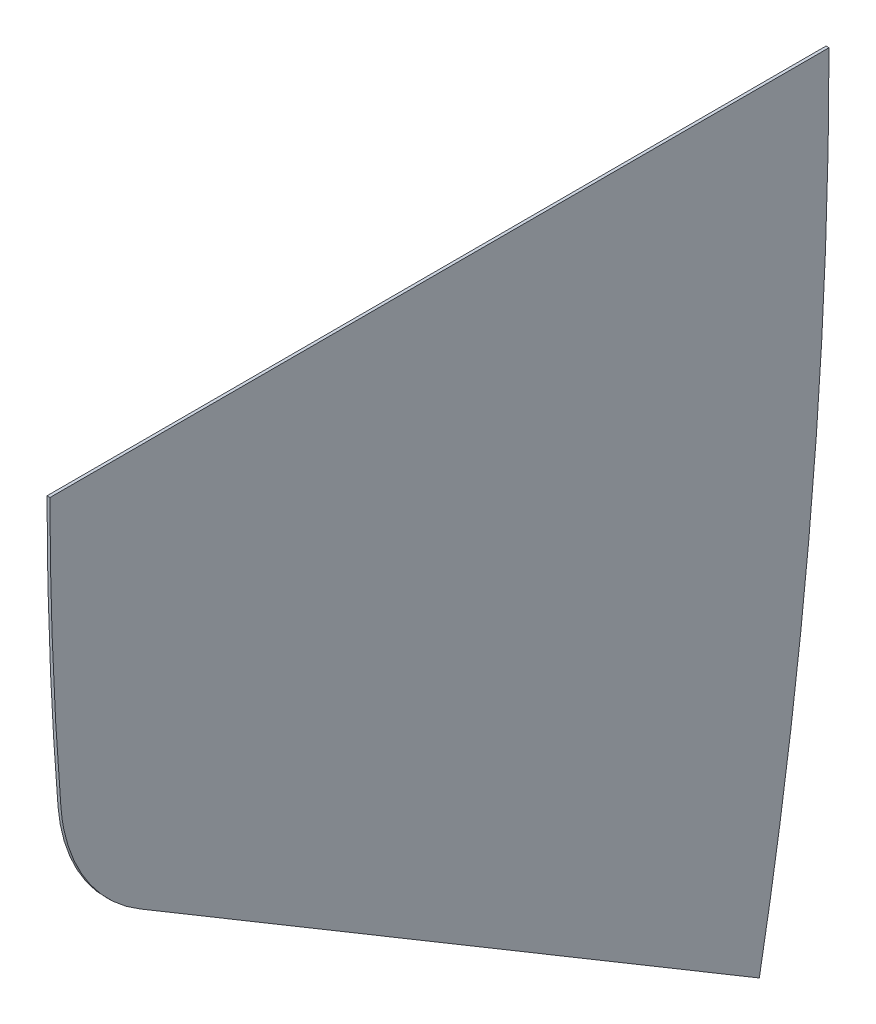
ISO-10303-21;
HEADER;
FILE_DESCRIPTION(('STEP AP214'),'2;1');
FILE_NAME('part.step','',(''),(''),'','','');
FILE_SCHEMA(('AUTOMOTIVE_DESIGN { 1 0 10303 214 1 1 1 1 }'));
ENDSEC;
DATA;
#1=APPLICATION_CONTEXT('core data for automotive mechanical design processes');
#2=APPLICATION_PROTOCOL_DEFINITION('international standard','automotive_design',2000,#1);
#3=PRODUCT_CONTEXT('',#1,'mechanical');
#4=PRODUCT('Part','Part','',(#3));
#5=PRODUCT_RELATED_PRODUCT_CATEGORY('part','',(#4));
#6=PRODUCT_DEFINITION_FORMATION('','',#4);
#7=PRODUCT_DEFINITION_CONTEXT('part definition',#1,'design');
#8=PRODUCT_DEFINITION('design','',#6,#7);
#9=PRODUCT_DEFINITION_SHAPE('','',#8);
#10=(LENGTH_UNIT() NAMED_UNIT(*) SI_UNIT(.MILLI.,.METRE.));
#11=(NAMED_UNIT(*) PLANE_ANGLE_UNIT() SI_UNIT($,.RADIAN.));
#12=(NAMED_UNIT(*) SI_UNIT($,.STERADIAN.) SOLID_ANGLE_UNIT());
#13=UNCERTAINTY_MEASURE_WITH_UNIT(LENGTH_MEASURE(1.E-05),#10,'distance_accuracy_value','');
#14=(GEOMETRIC_REPRESENTATION_CONTEXT(3) GLOBAL_UNCERTAINTY_ASSIGNED_CONTEXT((#13)) GLOBAL_UNIT_ASSIGNED_CONTEXT((#10,
#11,#12)) REPRESENTATION_CONTEXT('',''));
#15=CARTESIAN_POINT('',(0.,0.,0.));
#16=DIRECTION('',(0.,0.,1.));
#17=DIRECTION('',(1.,0.,0.));
#18=AXIS2_PLACEMENT_3D('',#15,#16,#17);
#19=CARTESIAN_POINT('',(-4.15667500419659E-13,1.81898940354586E-12,0.));
#20=DIRECTION('',(0.,1.,0.));
#21=DIRECTION('',(1.,0.,0.));
#22=AXIS2_PLACEMENT_3D('',#19,#20,#21);
#23=PLANE('',#22);
#24=DIRECTION('',(-1.,-3.97903932024659E-13,1.38032640872519E-12));
#25=VECTOR('',#24,1.);
#26=CARTESIAN_POINT('',(-4.00000000001002,-1.59161572810263E-12,5.5213056349146E-12));
#27=LINE('',#26,#25);
#28=CARTESIAN_POINT('',(0.,0.,0.));
#29=VERTEX_POINT('',#28);
#30=CARTESIAN_POINT('',(-8.00000000002005,-3.18323145620525E-12,1.10426112698292E-11));
#31=VERTEX_POINT('',#30);
#32=EDGE_CURVE('E29',#29,#31,#27,.T.);
#33=ORIENTED_EDGE('',*,*,#32,.T.);
#34=CARTESIAN_POINT('',(-8.00000000002005,-3.18323145620525E-12,1.10426112698292E-11));
#35=CARTESIAN_POINT('',(-8.00000000002688,-3.18323145620525E-12,2105.25840120508));
#36=(BOUNDED_CURVE() B_SPLINE_CURVE(1,(#34,#35),.UNSPECIFIED.,.F.,
.F.) B_SPLINE_CURVE_WITH_KNOTS((2,2),(15.0839182796827,2120.34231948474),
.UNSPECIFIED.) CURVE() GEOMETRIC_REPRESENTATION_ITEM() RATIONAL_B_SPLINE_CURVE((1.,1.)) REPRESENTATION_ITEM(''));
#37=CARTESIAN_POINT('',(-8.00000000002906,-2.27373675443232E-12,2105.25840120508));
#38=VERTEX_POINT('',#37);
#39=EDGE_CURVE('E103',#31,#38,#36,.T.);
#40=ORIENTED_EDGE('',*,*,#39,.T.);
#41=CARTESIAN_POINT('',(-8.00000000002688,-3.18323145620525E-12,2105.25840120508));
#42=CARTESIAN_POINT('',(0.,0.,2105.25840120506));
#43=(BOUNDED_CURVE() B_SPLINE_CURVE(1,(#41,#42),.UNSPECIFIED.,.F.,
.F.) B_SPLINE_CURVE_WITH_KNOTS((2,2),(-1.,0.),
.UNSPECIFIED.) CURVE() GEOMETRIC_REPRESENTATION_ITEM() RATIONAL_B_SPLINE_CURVE((1.,1.)) REPRESENTATION_ITEM(''));
#44=CARTESIAN_POINT('',(0.,0.,2105.25840120506));
#45=VERTEX_POINT('',#44);
#46=EDGE_CURVE('E10',#38,#45,#43,.T.);
#47=ORIENTED_EDGE('',*,*,#46,.T.);
#48=CARTESIAN_POINT('',(0.,0.,2105.25840120506));
#49=CARTESIAN_POINT('',(0.,0.,0.));
#50=(BOUNDED_CURVE() B_SPLINE_CURVE(1,(#48,#49),.UNSPECIFIED.,.F.,
.F.) B_SPLINE_CURVE_WITH_KNOTS((2,2),(-2120.34231948474,-15.0839182796827),
.UNSPECIFIED.) CURVE() GEOMETRIC_REPRESENTATION_ITEM() RATIONAL_B_SPLINE_CURVE((1.,1.)) REPRESENTATION_ITEM(''));
#51=EDGE_CURVE('E150',#45,#29,#50,.T.);
#52=ORIENTED_EDGE('',*,*,#51,.T.);
#53=EDGE_LOOP('',(#33,#40,#47,#52));
#54=FACE_BOUND('',#53,.T.);
#55=ADVANCED_FACE('F16',(#54),#23,.T.);
#56=CARTESIAN_POINT('',(0.,1.81898940354586E-12,2105.25840120506));
#57=CARTESIAN_POINT('',(3.26849658449646E-13,-247.452900952764,2105.15515744929));
#58=CARTESIAN_POINT('',(-1.98951966012828E-13,-494.858716043923,2095.21803900071));
#59=CARTESIAN_POINT('',(3.74811293113453E-13,-741.63099538606,2075.4575480513));
#60=CARTESIAN_POINT('',(1.24344978758018E-13,-775.896176998787,2072.7137534174));
#61=CARTESIAN_POINT('',(2.06057393370429E-13,-809.834151180558,2065.95534073106));
#62=CARTESIAN_POINT('',(3.05533376376843E-13,-842.729808078358,2055.24603988153));
#63=CARTESIAN_POINT('',(3.48165940522449E-13,-859.477529499785,2049.79375820789));
#64=CARTESIAN_POINT('',(0.,-875.932419384229,2043.32468240479));
#65=CARTESIAN_POINT('',(5.08038056068472E-13,-891.997989503351,2035.8566204281));
#66=CARTESIAN_POINT('',(0.,-908.074008811072,2028.38370115798));
#67=CARTESIAN_POINT('',(0.,-923.743471132829,2019.91822990809));
#68=CARTESIAN_POINT('',(2.16715534406831E-13,-938.908350284025,2010.4860880126));
#69=CARTESIAN_POINT('',(0.,-953.952906758594,2001.12878354561));
#70=CARTESIAN_POINT('',(2.8421709430404E-13,-968.482638028346,1990.83136278576));
#71=CARTESIAN_POINT('',(0.,-982.401314617929,1979.62858234086));
#72=CARTESIAN_POINT('',(1.84741111297626E-13,-996.097575264539,1968.60481869836));
#73=CARTESIAN_POINT('',(2.77111666946439E-13,-1009.18289712888,1956.71983361948));
#74=CARTESIAN_POINT('',(0.,-1021.5666033896,1944.01731140958));
#75=CARTESIAN_POINT('',(3.48165940522449E-13,-1045.41898726154,1919.55085286211));
#76=CARTESIAN_POINT('',(2.77111666946439E-13,-1066.55422213134,1892.16745836807));
#77=CARTESIAN_POINT('',(-1.63424829224823E-13,-1084.3680953132,1862.30488629375));
#78=CARTESIAN_POINT('',(-3.90798504668055E-13,-1417.22497501416,1304.31441402036));
#79=CARTESIAN_POINT('',(-2.02504679691629E-13,-1750.08185471511,746.323941746978));
#80=CARTESIAN_POINT('',(0.,-2082.93873441606,188.333469473596));
#81=CARTESIAN_POINT('',(-8.00000000002729,-1.36424205265939E-12,2105.25840120508));
#82=CARTESIAN_POINT('',(-8.00000000003119,-247.452900952755,2105.1551574493));
#83=CARTESIAN_POINT('',(-8.00000000003103,-494.858716043934,2095.21803900071));
#84=CARTESIAN_POINT('',(-8.00000000002858,-741.630995386065,2075.45754805132));
#85=CARTESIAN_POINT('',(-8.00000000003404,-775.896176998781,2072.71375341741));
#86=CARTESIAN_POINT('',(-8.00000000002793,-809.83415118057,2065.95534073108));
#87=CARTESIAN_POINT('',(-8.00000000002987,-842.729808078363,2055.24603988155));
#88=CARTESIAN_POINT('',(-8.00000000003063,-859.477529438666,2049.79375822866));
#89=CARTESIAN_POINT('',(-8.00000000003081,-875.932419353489,2043.32468242));
#90=CARTESIAN_POINT('',(-8.00000000003153,-891.997989503363,2035.85662042811));
#91=CARTESIAN_POINT('',(-8.00000000003352,-908.074008860786,2028.38370112981));
#92=CARTESIAN_POINT('',(-8.00000000002764,-923.743471033434,2019.91822996451));
#93=CARTESIAN_POINT('',(-8.00000000003154,-938.908350284038,2010.48608801263));
#94=CARTESIAN_POINT('',(-8.00000000002682,-953.952906758614,2001.12878354565));
#95=CARTESIAN_POINT('',(-8.00000000003134,-968.482638028377,1990.83136278578));
#96=CARTESIAN_POINT('',(-8.00000000003049,-982.401314617953,1979.62858234089));
#97=CARTESIAN_POINT('',(-8.00000000002989,-996.097575315775,1968.60481864994));
#98=CARTESIAN_POINT('',(-8.00000000003179,-1009.1828970265,1956.71983371639));
#99=CARTESIAN_POINT('',(-8.00000000003068,-1021.56660338963,1944.01731140961));
#100=CARTESIAN_POINT('',(-8.00000000002978,-1045.41898726157,1919.55085286212));
#101=CARTESIAN_POINT('',(-8.00000000003376,-1066.55422213136,1892.16745836809));
#102=CARTESIAN_POINT('',(-8.00000000003037,-1084.36809531324,1862.30488629376));
#103=CARTESIAN_POINT('',(-8.00000000002692,-1417.2249750142,1304.31441402039));
#104=CARTESIAN_POINT('',(-8.00000000002973,-1750.08185471513,746.323941746997));
#105=CARTESIAN_POINT('',(-8.00000000002873,-2082.93873441609,188.333469473608));
#106=B_SPLINE_SURFACE_WITH_KNOTS('',1,3,((#56,#57,#58,#59,#60,#61,#62,#63,#64,#65,#66,#67,#68,
#69,#70,#71,#72,#73,#74,#75,#76,#77,#78,#79,#80),(#81,#82,#83,#84,#85,#86,#87,#88,#89,#90,#91,
#92,#93,#94,#95,#96,#97,#98,#99,#100,#101,#102,#103,#104,#105)),.UNSPECIFIED.,.F.,.F.,.F.,(2,2),
(4,2,1,2,1,2,1,2,1,2,1,2,1,2,1,4),(0.,1.),(-3076.99961647915,-2390.84743342106,
-2390.84732984685,-2287.27322299327,-2287.27316998304,-2234.26299359608,-2234.26294019919,
-2180.86610504609,-2180.86605165316,-2127.47318000541,-2127.47312700673,-2074.47449503824,
-2074.47439150558,-1970.94183671468,-1970.9398875293,-21.756461844165),.UNSPECIFIED.);
#107=CARTESIAN_POINT('',(-8.00000000003125,-1.36424205265939E-12,2105.25840120508));
#108=CARTESIAN_POINT('',(-8.00000000002883,-5.33333653627741,2105.25617599548));
#109=CARTESIAN_POINT('',(-8.00000000002785,-10.666669578627,2105.24938266263));
#110=CARTESIAN_POINT('',(-8.00000000002722,-21.3333162006314,2105.22665976535));
#111=CARTESIAN_POINT('',(-8.00000000002756,-26.6666297802862,2105.21073020091));
#112=CARTESIAN_POINT('',(-8.0000000000282,-42.6665343510442,2105.14923713741));
#113=CARTESIAN_POINT('',(-8.00000000002812,-53.3330774357019,2105.08996927306));
#114=CARTESIAN_POINT('',(-8.00000000002825,-69.3326759723189,2104.97365946705));
#115=CARTESIAN_POINT('',(-8.00000000002834,-74.6658365350715,2104.93032156152));
#116=CARTESIAN_POINT('',(-8.00000000002856,-90.6652126589992,2104.78660383821));
#117=CARTESIAN_POINT('',(-8.00000000002867,-101.331310917789,2104.67252007893));
#118=CARTESIAN_POINT('',(-8.00000000002884,-117.330100662793,2104.47398790501));
#119=CARTESIAN_POINT('',(-8.0000000000289,-122.662968036407,2104.40324280433));
#120=CARTESIAN_POINT('',(-8.00000000002907,-138.66139421165,2104.17730421908));
#121=CARTESIAN_POINT('',(-8.00000000002917,-149.326765330117,2104.00840757686));
#122=CARTESIAN_POINT('',(-8.00000000002931,-165.324323611528,2103.7276582727));
#123=CARTESIAN_POINT('',(-8.00000000002936,-170.656757038703,2103.62950784272));
#124=CARTESIAN_POINT('',(-8.00000000002949,-186.653810602962,2103.32135436409));
#125=CARTESIAN_POINT('',(-8.00000000002958,-197.31817228601,2103.09764931259));
#126=CARTESIAN_POINT('',(-8.00000000002969,-213.314077649298,2102.73469025283));
#127=CARTESIAN_POINT('',(-8.00000000002973,-218.645936976619,2102.60913706245));
#128=CARTESIAN_POINT('',(-8.0000000000298,-229.309432729821,2102.3488971534));
#129=CARTESIAN_POINT('',(-8.00000000002983,-234.641069155701,2102.21421043473));
#130=CARTESIAN_POINT('',(-8.00000000002992,-250.635637107928,2101.79645010601));
#131=CARTESIAN_POINT('',(-8.00000000002998,-261.298215573631,2101.49967658955));
#132=CARTESIAN_POINT('',(-8.00000000003005,-277.291256919204,2101.02711990172));
#133=CARTESIAN_POINT('',(-8.00000000003008,-282.622130042598,2100.86503503364));
#134=CARTESIAN_POINT('',(-8.00000000003014,-298.614338716438,2100.36508216373));
#135=CARTESIAN_POINT('',(-8.00000000003017,-309.275251836833,2100.01351622283));
#136=CARTESIAN_POINT('',(-8.00000000003022,-325.265653679147,2099.45877551666));
#137=CARTESIAN_POINT('',(-8.00000000003024,-330.595623387773,2099.2692967606));
#138=CARTESIAN_POINT('',(-8.00000000003028,-346.585051469411,2098.68716451416));
#139=CARTESIAN_POINT('',(-8.0000000000303,-357.2440170663,2098.28081543241));
#140=CARTESIAN_POINT('',(-8.00000000003032,-373.231356953537,2097.64390533669));
#141=CARTESIAN_POINT('',(-8.00000000003032,-378.560282566113,2097.42703768613));
#142=CARTESIAN_POINT('',(-8.00000000003033,-394.546507629614,2096.76274142342));
#143=CARTESIAN_POINT('',(-8.00000000003034,-405.203243576567,2096.30161994743));
#144=CARTESIAN_POINT('',(-8.00000000003033,-421.18710032146,2095.58255720278));
#145=CARTESIAN_POINT('',(-8.00000000003033,-426.514841776036,2095.33830634137));
#146=CARTESIAN_POINT('',(-8.00000000003032,-437.169898454863,2094.84067830783));
#147=CARTESIAN_POINT('',(-8.00000000003031,-442.497213679116,2094.58730113569));
#148=CARTESIAN_POINT('',(-8.00000000003029,-458.47851303761,2093.81348042747));
#149=CARTESIAN_POINT('',(-8.00000000003027,-469.131839131172,2093.27934822714));
#150=CARTESIAN_POINT('',(-8.00000000003023,-485.110392062811,2092.45077867249));
#151=CARTESIAN_POINT('',(-8.00000000003022,-490.436334075147,2092.17002710726));
#152=CARTESIAN_POINT('',(-8.00000000003017,-506.413444487804,2091.31408666974));
#153=CARTESIAN_POINT('',(-8.00000000003013,-517.063885540216,2090.72521264342));
#154=CARTESIAN_POINT('',(-8.00000000003006,-533.037969554124,2089.8145381171));
#155=CARTESIAN_POINT('',(-8.00000000003004,-538.362398368752,2089.50641953759));
#156=CARTESIAN_POINT('',(-8.00000000002997,-554.334898930352,2088.56838190883));
#157=CARTESIAN_POINT('',(-8.00000000002992,-564.982173074652,2087.92478161736));
#158=CARTESIAN_POINT('',(-8.00000000002983,-580.951366083088,2086.93202615706));
#159=CARTESIAN_POINT('',(-8.0000000000298,-586.274141122954,2086.59654869189));
#160=CARTESIAN_POINT('',(-8.00000000002971,-602.241610043315,2085.5764386239));
#161=CARTESIAN_POINT('',(-8.00000000002964,-612.885436007668,2084.87812905686));
#162=CARTESIAN_POINT('',(-8.00000000002953,-628.849316291425,2083.80331886196));
#163=CARTESIAN_POINT('',(-8.0000000000295,-634.170297014964,2083.44049136343));
#164=CARTESIAN_POINT('',(-8.00000000002938,-650.132312422273,2082.33833579709));
#165=CARTESIAN_POINT('',(-8.0000000000293,-660.772408629621,2081.585335427));
#166=CARTESIAN_POINT('',(-8.00000000002917,-676.730555419505,2080.42849880831));
#167=CARTESIAN_POINT('',(-8.00000000002913,-682.04960183646,2080.03833081369));
#168=CARTESIAN_POINT('',(-8.00000000002904,-692.687019263293,2079.24888355142));
#169=CARTESIAN_POINT('',(-8.00000000002899,-698.00539027317,2078.84960428378));
#170=CARTESIAN_POINT('',(-8.00000000002889,-709.709013961665,2077.96086748423));
#171=CARTESIAN_POINT('',(-8.00000000002883,-716.094113874668,2077.46939757688));
#172=CARTESIAN_POINT('',(-8.00000000002871,-728.863316283927,2076.47332295028));
#173=CARTESIAN_POINT('',(-8.00000000002865,-735.247418775849,2075.96871817547));
#174=CARTESIAN_POINT('',(-8.00000000002858,-741.630995385658,2075.45754805136));
#175=B_SPLINE_CURVE_WITH_KNOTS('',3,(#107,#108,#109,#110,#111,#112,#113,#114,#115,#116,#117,
#118,#119,#120,#121,#122,#123,#124,#125,#126,#127,#128,#129,#130,#131,#132,#133,#134,#135,#136,
#137,#138,#139,#140,#141,#142,#143,#144,#145,#146,#147,#148,#149,#150,#151,#152,#153,#154,#155,
#156,#157,#158,#159,#160,#161,#162,#163,#164,#165,#166,#167,#168,#169,#170,#171,#172,#173,#174),
.UNSPECIFIED.,.F.,.F.,(4,2,2,2,2,2,2,2,2,2,2,2,2,2,2,2,2,2,2,2,2,2,2,2,2,2,2,2,2,2,2,2,2,4),(0.,
16.0000058691295,32.000011738259,64.0000586910628,80.0000645601916,112.000111512994,
128.000117382123,160.00016433493,176.00017020406,208.000217156876,224.000223026008,
240.00022889514,272.000275847978,288.000281717113,320.000328669972,336.00033453911,
368.000381491995,384.000387361136,416.00043431405,432.000440183195,448.000446052341,
480.000493005295,496.000498874446,528.000545827429,544.000551696582,576.00059864959,
592.000604518746,624.000651471772,640.00065734093,672.000704293964,688.000710163122,
704.00071603228,723.212661940371,742.42468913436),.UNSPECIFIED.);
#176=CARTESIAN_POINT('',(-8.00000000003318,-741.630995386066,2075.45754805132));
#177=VERTEX_POINT('',#176);
#178=EDGE_CURVE('E90',#38,#177,#175,.T.);
#179=CARTESIAN_POINT('',(-8.00000000003318,-741.630995386066,2075.45754805132));
#180=CARTESIAN_POINT('',(-8.00000000001899,-744.289635418737,2075.24465639558));
#181=CARTESIAN_POINT('',(-8.00000000001712,-746.946278973998,2075.00759796084));
#182=CARTESIAN_POINT('',(-8.00000000002164,-752.255106085203,2074.48519235494));
#183=CARTESIAN_POINT('',(-8.00000000002803,-754.907289124101,2074.19983992944));
#184=CARTESIAN_POINT('',(-8.00000000003504,-762.87038084379,2073.26975749913));
#185=CARTESIAN_POINT('',(-8.00000000002342,-768.172968519328,2072.55219190336));
#186=CARTESIAN_POINT('',(-8.00000000001534,-778.748689165453,2070.92415396594));
#187=CARTESIAN_POINT('',(-8.0000000000189,-784.021820034894,2070.0136680392));
#188=CARTESIAN_POINT('',(-8.00000000001986,-794.535274943497,2068.00026283031));
#189=CARTESIAN_POINT('',(-8.00000000001726,-799.775572175005,2066.89720332768));
#190=CARTESIAN_POINT('',(-8.0000000000215,-810.212911814114,2064.5004733204));
#191=CARTESIAN_POINT('',(-8.00000000002834,-815.40994925343,2063.20678123263));
#192=CARTESIAN_POINT('',(-8.0000000000312,-827.543624069777,2059.95002140985));
#193=CARTESIAN_POINT('',(-8.00000000002266,-834.459823323634,2057.91024616969));
#194=CARTESIAN_POINT('',(-8.0000000000161,-848.185635643477,2053.49276556197));
#195=CARTESIAN_POINT('',(-8.0000000000181,-854.995214918569,2051.11495537544));
#196=CARTESIAN_POINT('',(-8.00000000002066,-868.48980210446,2046.02738839882));
#197=CARTESIAN_POINT('',(-8.00000000002124,-875.174801443818,2043.31760886477));
#198=CARTESIAN_POINT('',(-8.00000000001752,-888.412591569281,2037.56884812182));
#199=CARTESIAN_POINT('',(-8.00000000001322,-894.965188970224,2034.52942160754));
#200=CARTESIAN_POINT('',(-8.00000000002554,-907.912431341659,2028.13198722104));
#201=CARTESIAN_POINT('',(-8.00000000004217,-914.307086293206,2024.77399954532));
#202=CARTESIAN_POINT('',(-7.99999999999659,-926.923684921277,2017.74721407832));
#203=CARTESIAN_POINT('',(-7.99999999993436,-933.145622668334,2014.0784056339));
#204=CARTESIAN_POINT('',(-7.99999999994478,-944.524390838169,2006.98569915214));
#205=CARTESIAN_POINT('',(-7.9999999999994,-949.706247816874,2003.60186023377));
#206=CARTESIAN_POINT('',(-8.00000000003936,-959.923262994748,1996.6181967364));
#207=CARTESIAN_POINT('',(-8.0000000000247,-964.958404527345,1993.01834776011));
#208=CARTESIAN_POINT('',(-8.00000000001406,-974.872859689961,1985.6090545326));
#209=CARTESIAN_POINT('',(-8.00000000001809,-979.752156496414,1981.79958777303));
#210=CARTESIAN_POINT('',(-8.00000000002067,-989.346182500254,1973.97777756267));
#211=CARTESIAN_POINT('',(-8.00000000001922,-994.060894642551,1969.96541319147));
#212=CARTESIAN_POINT('',(-8.00000000001954,-1003.31226198944,1961.74935855731));
#213=CARTESIAN_POINT('',(-8.00000000002129,-1007.8490875886,1957.54586015084));
#214=CARTESIAN_POINT('',(-8.00000000001747,-1016.74128300219,1948.95155739411));
#215=CARTESIAN_POINT('',(-8.00000000001189,-1021.09666219929,1944.56076275285));
#216=CARTESIAN_POINT('',(-8.00000000002687,-1029.61747065411,1935.60049760878));
#217=CARTESIAN_POINT('',(-8.00000000004744,-1033.78294169414,1931.03106682325));
#218=CARTESIAN_POINT('',(-7.99999999999133,-1041.91613243405,1921.72239662815));
#219=CARTESIAN_POINT('',(-7.9999999999147,-1045.88392918713,1916.98322464153));
#220=CARTESIAN_POINT('',(-7.99999999995671,-1051.8637590979,1909.52720239022));
#221=CARTESIAN_POINT('',(-8.00000000000258,-1053.94715998463,1906.86726769759));
#222=CARTESIAN_POINT('',(-8.00000000003617,-1058.05174188693,1901.50060602287));
#223=CARTESIAN_POINT('',(-8.0000000000239,-1060.07293550647,1898.79388869541));
#224=CARTESIAN_POINT('',(-8.00000000001486,-1064.05221889987,1893.33489959086));
#225=CARTESIAN_POINT('',(-8.00000000001809,-1066.01031507998,1890.58263248165));
#226=CARTESIAN_POINT('',(-8.00000000002066,-1069.85895754163,1885.03895276289));
#227=CARTESIAN_POINT('',(-8.00000000002001,-1071.74962425984,1882.24762377363));
#228=CARTESIAN_POINT('',(-8.00000000001875,-1075.46646299771,1876.62195018349));
#229=CARTESIAN_POINT('',(-8.00000000001815,-1077.29262852384,1873.78760129251));
#230=CARTESIAN_POINT('',(-8.00000000002061,-1080.87967416414,1868.07709341005));
#231=CARTESIAN_POINT('',(-8.00000000002367,-1082.64054106726,1865.20092612009));
#232=CARTESIAN_POINT('',(-8.00000000003037,-1084.36809531317,1862.30488629373));
#233=B_SPLINE_CURVE_WITH_KNOTS('',3,(#179,#180,#181,#182,#183,#184,#185,#186,#187,#188,#189,
#190,#191,#192,#193,#194,#195,#196,#197,#198,#199,#200,#201,#202,#203,#204,#205,#206,#207,#208,
#209,#210,#211,#212,#213,#214,#215,#216,#217,#218,#219,#220,#221,#222,#223,#224,#225,#226,#227,
#228,#229,#230,#231,#232),.UNSPECIFIED.,.F.,.F.,(4,2,2,2,2,2,2,2,2,2,2,2,2,2,2,2,2,2,2,2,2,2,2,
2,2,2,4),(0.,8.00121789493779,16.003306878221,32.0521914043726,48.1022064393467,
64.1639572463015,80.2275279381094,101.850574553961,123.480340798494,145.111589776567,
166.772432228417,188.431902319156,210.092115073114,228.653360297039,247.216705884335,
265.7820486732,284.349309619694,302.898327707163,321.446385421754,339.990342426704,
358.527013537144,368.662440447924,378.795800090827,388.928127634983,399.041345188003,
409.155577983643,419.271846020316),.UNSPECIFIED.);
#234=CARTESIAN_POINT('',(-8.00000000003586,-1084.36809531317,1862.30488629372));
#235=VERTEX_POINT('',#234);
#236=EDGE_CURVE('E86',#177,#235,#233,.T.);
#237=DIRECTION('',(0.,0.512301524512095,0.85880565204392));
#238=VECTOR('',#237,1.);
#239=CARTESIAN_POINT('',(-8.00000000001938,-2082.93873441609,188.333469473604));
#240=LINE('',#239,#238);
#241=CARTESIAN_POINT('',(-8.00000000002422,-2082.93873441609,188.333469473604));
#242=VERTEX_POINT('',#241);
#243=EDGE_CURVE('E93',#235,#242,#240,.F.);
#244=CARTESIAN_POINT('',(0.,-2082.93873441606,188.333469473596));
#245=CARTESIAN_POINT('',(-8.00000000002905,-2082.93873441609,188.333469473604));
#246=(BOUNDED_CURVE() B_SPLINE_CURVE(1,(#244,#245),.UNSPECIFIED.,.F.,
.F.) B_SPLINE_CURVE_WITH_KNOTS((2,2),(0.,1.),
.UNSPECIFIED.) CURVE() GEOMETRIC_REPRESENTATION_ITEM() RATIONAL_B_SPLINE_CURVE((1.,1.)) REPRESENTATION_ITEM(''));
#247=CARTESIAN_POINT('',(-9.70423741364355E-12,-2082.93873441606,188.333469473596));
#248=VERTEX_POINT('',#247);
#249=EDGE_CURVE('E146',#248,#242,#246,.T.);
#250=DIRECTION('',(0.,-0.512301524512095,-0.85880565204392));
#251=VECTOR('',#250,1.);
#252=CARTESIAN_POINT('',(-1.94013693999295E-11,-1084.36809531321,1862.30488629375));
#253=LINE('',#252,#251);
#254=CARTESIAN_POINT('',(9.45555102843074E-12,-1084.36809531314,1862.30488629371));
#255=VERTEX_POINT('',#254);
#256=EDGE_CURVE('E22',#248,#255,#253,.F.);
#257=CARTESIAN_POINT('',(9.45555102843074E-12,-1084.36809531314,1862.30488629371));
#258=CARTESIAN_POINT('',(-1.8675376663166E-11,-1083.00194296951,1864.59506594582));
#259=CARTESIAN_POINT('',(-2.30605452548019E-11,-1081.61499691188,1866.8727713385));
#260=CARTESIAN_POINT('',(-1.57405633363564E-11,-1078.79928633017,1871.40359248344));
#261=CARTESIAN_POINT('',(-4.02824351709439E-12,-1077.37050345073,1873.65669682862));
#262=CARTESIAN_POINT('',(8.12075979478621E-12,-1073.01403925301,1880.39030838118));
#263=CARTESIAN_POINT('',(-1.46432972006018E-11,-1070.02461014265,1884.83108475072));
#264=CARTESIAN_POINT('',(-2.41600381286176E-11,-1063.88533983922,1893.60101441637));
#265=CARTESIAN_POINT('',(-1.09082068830547E-11,-1060.73547858195,1897.93015364825));
#266=CARTESIAN_POINT('',(-2.78937530181844E-11,-1054.28014278857,1906.47018624175));
#267=CARTESIAN_POINT('',(-5.81271421627027E-11,-1050.97468255008,1910.68109041116));
#268=CARTESIAN_POINT('',(1.93194514616935E-11,-1044.21263649073,1918.9790322758));
#269=CARTESIAN_POINT('',(1.2698179961179E-10,-1040.75607004849,1923.06608574109));
#270=CARTESIAN_POINT('',(-6.3066179941809E-11,-1035.46685089256,1929.09350263739));
#271=CARTESIAN_POINT('',(-1.84543861813361E-10,-1033.6892361965,1931.08242572242));
#272=CARTESIAN_POINT('',(1.45716701068984E-10,-1030.09835505046,1935.02735465545));
#273=CARTESIAN_POINT('',(5.97370178973226E-10,-1028.28509391168,1936.98336532789));
#274=CARTESIAN_POINT('',(-2.98601184480304E-10,-1025.53889358696,1939.89224546587));
#275=CARTESIAN_POINT('',(-8.59417695787243E-10,-1024.61916585833,1940.85762449646));
#276=CARTESIAN_POINT('',(4.29692208172001E-10,-1023.23302242804,1942.29938634344));
#277=CARTESIAN_POINT('',(1.2144441172087E-09,-1022.76988445301,1942.77892066268));
#278=CARTESIAN_POINT('',(-6.07266867998983E-10,-1022.07354654455,1943.49663809792));
#279=CARTESIAN_POINT('',(-1.71430781182289E-09,-1021.84116231008,1943.7356130049));
#280=CARTESIAN_POINT('',(5.3528827266154E-11,-1021.60123627093,1943.98178308248));
#281=CARTESIAN_POINT('',(1.0985477985295E-10,-1021.59396552448,1943.98924251881));
#282=CARTESIAN_POINT('',(-5.49908451331523E-11,-1021.58305900733,1944.00043128588));
#283=CARTESIAN_POINT('',(-1.51495145719277E-10,-1021.57942343536,1944.00416081033));
#284=CARTESIAN_POINT('',(-6.95098785717083E-11,-1021.57396997803,1944.00975500012));
#285=CARTESIAN_POINT('',(-4.39116985987992E-12,-1021.57215214235,1944.0116197139));
#286=CARTESIAN_POINT('',(2.13172776932409E-12,-1021.56942536403,1944.01441676039));
#287=CARTESIAN_POINT('',(-1.08865005915796E-11,-1021.56851643379,1944.01534910518));
#288=CARTESIAN_POINT('',(4.02384061890889E-12,-1021.56726664897,1944.0166310737));
#289=CARTESIAN_POINT('',(1.14459070554432E-11,-1021.56692579797,1944.0169807009));
#290=CARTESIAN_POINT('',(-1.53606840432001E-11,-1021.5661304777,1944.01779649646));
#291=CARTESIAN_POINT('',(-6.42975895020909E-11,-1021.56567600799,1944.01826266438));
#292=CARTESIAN_POINT('',(-2.26991468031024E-10,-1021.56340365423,1944.02059349893));
#293=CARTESIAN_POINT('',(-9.47764950420219E-11,-1021.56158575458,1944.02245815034));
#294=CARTESIAN_POINT('',(3.78893699820632E-10,-1021.5524961736,1944.03178132676));
#295=CARTESIAN_POINT('',(1.58134910035499E-10,-1021.54522424404,1944.03923960976));
#296=CARTESIAN_POINT('',(-6.32749113927361E-10,-1021.50886327141,1944.07652973348));
#297=CARTESIAN_POINT('',(-2.6414453630872E-10,-1021.4797702547,1944.10635769959));
#298=CARTESIAN_POINT('',(1.05638004607382E-09,-1021.3342839668,1944.25547688005));
#299=CARTESIAN_POINT('',(4.40804147693183E-10,-1021.21782713556,1944.37470609));
#300=CARTESIAN_POINT('',(-1.76337496215383E-09,-1020.63520321007,1944.97052223202));
#301=CARTESIAN_POINT('',(-7.30850669792774E-10,-1020.16802018973,1945.44611597221));
#302=CARTESIAN_POINT('',(2.92352786801497E-09,-1017.82663515344,1947.81884017442));
#303=CARTESIAN_POINT('',(1.01993920457484E-09,-1015.93623980109,1949.70001509931));
#304=CARTESIAN_POINT('',(-2.04109503010237E-09,-1010.21122414057,1955.29440774181));
#305=CARTESIAN_POINT('',(-5.41992931180894E-10,-1006.32552591635,1958.95560142581));
#306=CARTESIAN_POINT('',(5.03231295308172E-10,-998.423240439252,1966.13434912675));
#307=CARTESIAN_POINT('',(4.91998076135201E-11,-994.406642915712,1969.65189182347));
#308=CARTESIAN_POINT('',(-2.44719873886699E-10,-986.248401895406,1976.53820258331));
#309=CARTESIAN_POINT('',(-8.46587554548209E-11,-982.10676874719,1979.90698290219));
#310=CARTESIAN_POINT('',(4.58616476751145E-11,-973.703295764445,1986.4918704095));
#311=CARTESIAN_POINT('',(1.63045705544641E-11,-969.441445588192,1989.70796439878));
#312=CARTESIAN_POINT('',(-1.60925477085324E-11,-960.79318289301,1995.99042824442));
#313=CARTESIAN_POINT('',(-1.88684798919202E-11,-956.406496679034,1999.05642135826));
#314=CARTESIAN_POINT('',(-1.99342973841645E-11,-947.523878295462,2005.02655820764));
#315=CARTESIAN_POINT('',(-1.82238587724688E-11,-943.027938260848,2007.93069024119));
#316=CARTESIAN_POINT('',(-2.05793262146656E-11,-933.931382533198,2013.57407101274));
#317=CARTESIAN_POINT('',(-2.46474213109446E-11,-929.330727821564,2016.31325685548));
#318=CARTESIAN_POINT('',(-1.41554534327584E-11,-920.032629056382,2021.62183794983));
#319=CARTESIAN_POINT('',(4.04126822678182E-13,-915.335187514078,2024.19123759948));
#320=CARTESIAN_POINT('',(-1.60583046390796E-13,-905.849293755019,2029.1571051283));
#321=CARTESIAN_POINT('',(-1.52874260050077E-11,-901.060833746351,2031.55355811685));
#322=CARTESIAN_POINT('',(-2.35153066299197E-11,-891.399532841877,2036.17015758081));
#323=CARTESIAN_POINT('',(-1.66163773028536E-11,-886.526692072529,2038.39030432043));
#324=CARTESIAN_POINT('',(-2.07932657704918E-11,-879.160490224581,2041.58544749317));
#325=CARTESIAN_POINT('',(-2.46040577572588E-11,-876.696136601446,2042.62777235075));
#326=CARTESIAN_POINT('',(-1.41989094866062E-11,-871.748947090922,2044.66724994411));
#327=CARTESIAN_POINT('',(0.,-869.26611201982,2045.66440466133));
#328=CARTESIAN_POINT('',(-5.82317224671728E-11,-861.791329016926,2048.58752368056));
#329=CARTESIAN_POINT('',(-2.31559406353074E-10,-856.772488069559,2050.44540970143));
#330=CARTESIAN_POINT('',(1.15873141911885E-10,-849.204268900316,2053.0911144242));
#331=CARTESIAN_POINT('',(3.3210799257074E-10,-846.678865602243,2053.94825965614));
#332=CARTESIAN_POINT('',(-4.11648523594433E-11,-843.829282571137,2054.88663580655));
#333=CARTESIAN_POINT('',(-9.12004547356317E-11,-843.512555397552,2054.99053624941));
#334=CARTESIAN_POINT('',(2.31833983189797E-11,-843.116499411611,2055.11996173212));
#335=CARTESIAN_POINT('',(5.49065656379145E-11,-843.037280899441,2055.1458243134));
#336=CARTESIAN_POINT('',(-2.69941395525861E-11,-842.918442122651,2055.18458442542));
#337=CARTESIAN_POINT('',(-7.58752822584299E-11,-842.878827362898,2055.19749883592));
#338=CARTESIAN_POINT('',(3.83963519305349E-11,-842.819402473133,2055.21686201091));
#339=CARTESIAN_POINT('',(1.07752454084286E-10,-842.799593718264,2055.22331499575));
#340=CARTESIAN_POINT('',(-5.34177374502254E-11,-842.769879898719,2055.23299236277));
#341=CARTESIAN_POINT('',(-1.51341858537381E-10,-842.759975177673,2055.23621780007));
#342=CARTESIAN_POINT('',(-7.16741028744913E-11,-842.745117924314,2055.24105542841));
#343=CARTESIAN_POINT('',(-7.35919481346593E-12,-842.740165477897,2055.24266788325));
#344=CARTESIAN_POINT('',(2.22173260824205E-12,-842.733974884105,2055.24468334193));
#345=CARTESIAN_POINT('',(5.9728271057383E-13,-842.732736763558,2055.24508642817));
#346=CARTESIAN_POINT('',(1.96133291851225E-13,-842.731034345338,2055.24564066417));
#347=CARTESIAN_POINT('',(2.74140526663875E-13,-842.730570049208,2055.24579181867));
#348=CARTESIAN_POINT('',(3.38235808447438E-13,-842.729622110773,2055.24610042423));
#349=CARTESIAN_POINT('',(3.20358460221386E-13,-842.729138468448,2055.24625787522));
#350=CARTESIAN_POINT('',(2.67568746481651E-13,-842.727416700796,2055.24681839777));
#351=CARTESIAN_POINT('',(2.49588068831436E-13,-842.726178573954,2055.24722146468));
#352=CARTESIAN_POINT('',(5.29241009104352E-13,-842.719987930797,2055.24923677172));
#353=CARTESIAN_POINT('',(1.93554361291377E-12,-842.715035387648,2055.25084892944));
#354=CARTESIAN_POINT('',(-6.21480581704513E-12,-842.690272528758,2055.2589092784));
#355=CARTESIAN_POINT('',(-6.13170453796889E-11,-842.670461783712,2055.26535615078));
#356=CARTESIAN_POINT('',(-2.45875140569613E-10,-842.571405766861,2055.29758347949));
#357=CARTESIAN_POINT('',(-1.02471649556845E-10,-842.492153629185,2055.32334283316));
#358=CARTESIAN_POINT('',(4.1140972545857E-10,-842.095856183865,2055.45202709774));
#359=CARTESIAN_POINT('',(1.72477836248681E-10,-841.778701180816,2055.55461430996));
#360=CARTESIAN_POINT('',(-6.88409469518303E-10,-840.192332643325,2056.06575206697));
#361=CARTESIAN_POINT('',(-3.09007774355093E-10,-838.921375371701,2056.4688957096));
#362=CARTESIAN_POINT('',(3.23495135770134E-10,-835.102744623178,2057.66107759973));
#363=CARTESIAN_POINT('',(7.06746358242692E-11,-832.549626074924,2058.43276252233));
#364=CARTESIAN_POINT('',(-1.09490409404104E-10,-827.429458132006,2059.92967977838));
#365=CARTESIAN_POINT('',(-3.67878501960494E-11,-824.862406774891,2060.65490537359));
#366=CARTESIAN_POINT('',(7.45527494162027E-11,-817.125952970014,2062.76477619779));
#367=CARTESIAN_POINT('',(5.30766333304461E-12,-811.937054030146,2064.07868078789));
#368=CARTESIAN_POINT('',(-4.41135400625224E-11,-801.5142480677,2066.51645801602));
#369=CARTESIAN_POINT('',(-2.4278344922819E-11,-796.280335412995,2067.64030649971));
#370=CARTESIAN_POINT('',(-1.45238380868084E-11,-785.774391658284,2069.69644546166));
#371=CARTESIAN_POINT('',(-2.4607935924146E-11,-780.502356282195,2070.62871409497));
#372=CARTESIAN_POINT('',(-1.41954355909331E-11,-769.928319744895,2072.30019687843));
#373=CARTESIAN_POINT('',(6.29744648449805E-12,-764.626322303057,2073.03943447527));
#374=CARTESIAN_POINT('',(-3.06141410021988E-12,-756.37147811476,2074.03723411869));
#375=CARTESIAN_POINT('',(-1.45217185099435E-11,-753.426610098025,2074.36305253148));
#376=CARTESIAN_POINT('',(-2.42786798672526E-11,-747.532308637776,2074.95500920542));
#377=CARTESIAN_POINT('',(-2.2581647847113E-11,-744.582878061424,2075.22117601595));
#378=CARTESIAN_POINT('',(3.74811190692003E-13,-741.630995385655,2075.45754805134));
#379=B_SPLINE_CURVE_WITH_KNOTS('',3,(#257,#258,#259,#260,#261,#262,#263,#264,#265,#266,#267,
#268,#269,#270,#271,#272,#273,#274,#275,#276,#277,#278,#279,#280,#281,#282,#283,#284,#285,#286,
#287,#288,#289,#290,#291,#292,#293,#294,#295,#296,#297,#298,#299,#300,#301,#302,#303,#304,#305,
#306,#307,#308,#309,#310,#311,#312,#313,#314,#315,#316,#317,#318,#319,#320,#321,#322,#323,#324,
#325,#326,#327,#328,#329,#330,#331,#332,#333,#334,#335,#336,#337,#338,#339,#340,#341,#342,#343,
#344,#345,#346,#347,#348,#349,#350,#351,#352,#353,#354,#355,#356,#357,#358,#359,#360,#361,#362,
#363,#364,#365,#366,#367,#368,#369,#370,#371,#372,#373,#374,#375,#376,#377,#378),.UNSPECIFIED.,
.F.,.F.,(4,2,2,2,2,2,2,2,2,2,2,2,2,2,2,2,2,2,2,2,2,2,2,2,2,2,2,2,2,2,2,2,2,2,2,2,2,2,2,2,2,2,2,
2,2,2,2,2,2,2,2,2,2,2,2,2,2,2,2,2,4),(0.,7.99987253880648,16.0033091210846,32.0591587179301,
48.1170212698739,64.1734111728535,80.2277479300866,88.2299941560879,96.2310569773185,
100.231098325396,102.231103494273,103.231104140417,103.262354140437,103.27797914044,
103.28579164044,103.28969789044,103.291162734209,103.29311585921,103.30092835921,
103.33217835923,103.457178360492,103.957178441232,105.95718360858,113.957514370234,
129.970144189901,145.984033436632,161.99660091081,178.010550099696,194.062824147878,
210.116257218539,226.175773323523,242.234873269386,258.295354251093,274.355811165438,
282.382581407307,290.408999203013,306.459824130388,314.460154719654,315.460155365259,
315.710155375347,315.835155376609,315.897655376767,315.928905376786,315.944530376789,
315.948436626789,315.949901470539,315.951427349442,315.955333599442,315.970958599445,
316.033458599603,316.28345860969,317.283459255184,321.283500569112,329.284575254425,
337.286807764709,353.34091067454,369.397052379073,385.45502387477,401.511043964886,
410.399017888866,419.282728881732),.UNSPECIFIED.);
#380=CARTESIAN_POINT('',(1.0262901486001E-11,-741.630995386061,2075.4575480513));
#381=VERTEX_POINT('',#380);
#382=EDGE_CURVE('E37',#255,#381,#379,.T.);
#383=CARTESIAN_POINT('',(1.0262901486001E-11,-741.630995386061,2075.4575480513));
#384=CARTESIAN_POINT('',(-3.50493550804627E-11,-736.314681896155,2075.88325626813));
#385=CARTESIAN_POINT('',(-6.40479587296382E-11,-730.997997919161,2076.30441130693));
#386=CARTESIAN_POINT('',(-1.49628218518929E-10,-704.41265734064,2078.38742613175));
#387=CARTESIAN_POINT('',(-2.79683767465782E-11,-683.138589687673,2079.98097649949));
#388=CARTESIAN_POINT('',(1.43220046969357E-11,-651.219813819813,2082.26193365953));
#389=CARTESIAN_POINT('',(5.05240966314341E-12,-640.578966227686,2083.00402313466));
#390=CARTESIAN_POINT('',(-9.5540071115932E-12,-608.652562863895,2085.175609344));
#391=CARTESIAN_POINT('',(-1.68826268573111E-12,-587.363240151916,2086.55041684748));
#392=CARTESIAN_POINT('',(1.03378866750002E-12,-555.422706204079,2088.50318660989));
#393=CARTESIAN_POINT('',(4.2838955861991E-13,-544.774793351034,2089.13586834315));
#394=CARTESIAN_POINT('',(-5.29646541544748E-13,-512.827756455382,2090.97919455822));
#395=CARTESIAN_POINT('',(0.,-491.52542779041,2092.1351140035));
#396=CARTESIAN_POINT('',(1.50063023526964E-13,-459.566510051931,2093.75949019924));
#397=CARTESIAN_POINT('',(1.10765695250528E-13,-448.912656803631,2094.28269740474));
#398=CARTESIAN_POINT('',(0.,-416.948361492413,2095.79756905645));
#399=CARTESIAN_POINT('',(0.,-395.635277634465,2096.73447844962));
#400=CARTESIAN_POINT('',(1.02561205823656E-13,-363.661351822396,2098.03028968259));
#401=CARTESIAN_POINT('',(1.02112943825595E-13,-353.002683344878,2098.44396716086));
#402=CARTESIAN_POINT('',(1.04694179436301E-13,-321.024508045613,2099.63022439498));
#403=CARTESIAN_POINT('',(1.11649737160328E-13,-299.702925175708,2100.34802482596));
#404=CARTESIAN_POINT('',(1.18382323343664E-13,-267.717360662025,2101.31513453357));
#405=CARTESIAN_POINT('',(1.20009727495038E-13,-257.05499759357,2101.61923873091));
#406=CARTESIAN_POINT('',(1.22776245232464E-13,-235.72929192708,2102.19091525536));
#407=CARTESIAN_POINT('',(1.23915358818516E-13,-225.065949329045,2102.45848758246));
#408=CARTESIAN_POINT('',(1.25745569077406E-13,-193.074509598195,2103.20640446073));
#409=CARTESIAN_POINT('',(1.248495112496E-13,-171.745094394909,2103.6319460707));
#410=CARTESIAN_POINT('',(1.18641253171924E-13,-139.749287690772,2104.16063444145));
#411=CARTESIAN_POINT('',(1.15761150281873E-13,-129.08376161571,2104.3185929973));
#412=CARTESIAN_POINT('',(1.04776715565599E-13,-98.6831829301879,2104.71674350199));
#413=CARTESIAN_POINT('',(0.,-78.94752854437,2104.91265423853));
#414=CARTESIAN_POINT('',(0.,-39.4745812213413,2105.17936878237));
#415=CARTESIAN_POINT('',(0.,-19.7372882501548,2105.25016756138));
#416=CARTESIAN_POINT('',(0.,1.81898940354586E-12,2105.25840120506));
#417=B_SPLINE_CURVE_WITH_KNOTS('',3,(#383,#384,#385,#386,#387,#388,#389,#390,#391,#392,#393,
#394,#395,#396,#397,#398,#399,#400,#401,#402,#403,#404,#405,#406,#407,#408,#409,#410,#411,#412,
#413,#414,#415,#416),.UNSPECIFIED.,.F.,.F.,(4,2,2,2,2,2,2,2,2,2,2,2,2,2,2,2,4),(0.,
16.0000058651861,80.0003814943702,112.000428447405,176.000804076593,208.000851029602,
272.001226658456,304.001273611411,368.001649239803,400.001696192698,464.002071820634,
496.002118773479,528.00216572631,592.002541353821,624.002588306627,683.21204111741,
742.423873516193),.UNSPECIFIED.);
#418=EDGE_CURVE('E116',#381,#45,#417,.T.);
#419=ORIENTED_EDGE('',*,*,#46,.F.);
#420=ORIENTED_EDGE('',*,*,#178,.T.);
#421=ORIENTED_EDGE('',*,*,#236,.T.);
#422=ORIENTED_EDGE('',*,*,#243,.T.);
#423=ORIENTED_EDGE('',*,*,#249,.F.);
#424=ORIENTED_EDGE('',*,*,#256,.T.);
#425=ORIENTED_EDGE('',*,*,#382,.T.);
#426=ORIENTED_EDGE('',*,*,#418,.T.);
#427=EDGE_LOOP('',(#419,#420,#421,#422,#423,#424,#425,#426));
#428=FACE_BOUND('',#427,.T.);
#429=ADVANCED_FACE('F96',(#428),#106,.T.);
#430=CARTESIAN_POINT('',(0.,-2082.93873441606,188.333469473596));
#431=CARTESIAN_POINT('',(0.,-1741.11102111854,126.016444152564));
#432=CARTESIAN_POINT('',(-2.98427949019242E-13,-1396.94779022995,79.1218756151205));
#433=CARTESIAN_POINT('',(-2.30926389122033E-13,-1051.49676226996,47.7131374232301));
#434=CARTESIAN_POINT('',(1.54543045027822E-13,-701.798675974749,15.9182526214317));
#435=CARTESIAN_POINT('',(-1.16351372980716E-12,-350.939133229699,0.00664080574421499));
#436=CARTESIAN_POINT('',(-4.15667500419659E-13,1.81898940354586E-12,0.));
#437=CARTESIAN_POINT('',(-8.00000000003105,-2082.93873441608,188.333469473597));
#438=CARTESIAN_POINT('',(-8.00000000002522,-1741.11102111852,126.016444152579));
#439=CARTESIAN_POINT('',(-8.00000000003032,-1396.94779022993,79.1218756151071));
#440=CARTESIAN_POINT('',(-8.00000000002426,-1051.49676226996,47.7131374232415));
#441=CARTESIAN_POINT('',(-8.00000000002165,-701.798675974766,15.9182526214503));
#442=CARTESIAN_POINT('',(-8.00000000002061,-350.939133229711,0.00664080576249126));
#443=CARTESIAN_POINT('',(-8.00000000002047,-1.36424205265939E-12,1.10915721052152E-11));
#444=B_SPLINE_SURFACE_WITH_KNOTS('',1,3,((#430,#431,#432,#433,#434,#435,#436),(#437,#438,#439,
#440,#441,#442,#443)),.UNSPECIFIED.,.F.,.F.,.F.,(2,2),(4,3,4),(0.,1.),(-2089.97474350399,
-1077.7007368071,-54.1386545832047),.UNSPECIFIED.);
#445=CARTESIAN_POINT('',(-8.00000000002905,-2082.93873441609,188.333469473604));
#446=CARTESIAN_POINT('',(-8.00000000002318,-1741.11102111853,126.016444152586));
#447=CARTESIAN_POINT('',(-8.00000000002913,-1396.94779022993,79.1218756151106));
#448=CARTESIAN_POINT('',(-8.00000000002303,-1051.49676226996,47.7131374232451));
#449=CARTESIAN_POINT('',(-8.00000000002043,-701.79867597477,15.9182526214538));
#450=CARTESIAN_POINT('',(-8.00000000001977,-350.939133229715,0.0066408057623929));
#451=CARTESIAN_POINT('',(-8.00000000002005,-3.18323145620525E-12,1.10426112698292E-11));
#452=(BOUNDED_CURVE() B_SPLINE_CURVE(3,(#445,#446,#447,#448,#449,#450,#451),.UNSPECIFIED.,.F.,
.F.) B_SPLINE_CURVE_WITH_KNOTS((4,3,4),(-2089.97474350399,-1077.7007368071,-54.1386545832047),
.UNSPECIFIED.) CURVE() GEOMETRIC_REPRESENTATION_ITEM() RATIONAL_B_SPLINE_CURVE((1.,1.,1.,1.,1.,
1.,1.)) REPRESENTATION_ITEM(''));
#453=EDGE_CURVE('E98',#242,#31,#452,.T.);
#454=CARTESIAN_POINT('',(0.,0.,0.));
#455=CARTESIAN_POINT('',(-7.44293515708705E-13,-350.9391332297,0.0066408057441657));
#456=CARTESIAN_POINT('',(5.71986902286881E-13,-701.79867597475,15.9182526214317));
#457=CARTESIAN_POINT('',(-2.30926389122033E-13,-1051.49676226996,47.7131374232301));
#458=CARTESIAN_POINT('',(-2.98427949019242E-13,-1396.94779022995,79.1218756151205));
#459=CARTESIAN_POINT('',(0.,-1741.11102111854,126.016444152564));
#460=CARTESIAN_POINT('',(0.,-2082.93873441606,188.333469473596));
#461=(BOUNDED_CURVE() B_SPLINE_CURVE(3,(#454,#455,#456,#457,#458,#459,#460),.UNSPECIFIED.,.F.,
.F.) B_SPLINE_CURVE_WITH_KNOTS((4,3,4),(54.1386545832047,1077.7007368071,2089.97474350399),
.UNSPECIFIED.) CURVE() GEOMETRIC_REPRESENTATION_ITEM() RATIONAL_B_SPLINE_CURVE((1.,1.,1.,1.,1.,
1.,1.)) REPRESENTATION_ITEM(''));
#462=EDGE_CURVE('E143',#29,#248,#461,.T.);
#463=ORIENTED_EDGE('',*,*,#249,.T.);
#464=ORIENTED_EDGE('',*,*,#453,.T.);
#465=ORIENTED_EDGE('',*,*,#32,.F.);
#466=ORIENTED_EDGE('',*,*,#462,.T.);
#467=EDGE_LOOP('',(#463,#464,#465,#466));
#468=FACE_BOUND('',#467,.T.);
#469=ADVANCED_FACE('F18',(#468),#444,.T.);
#470=CARTESIAN_POINT('',(-8.00000000001938,55.6865464250113,-21.0525942418755));
#471=DIRECTION('',(-1.,0.,0.));
#472=DIRECTION('',(0.,0.,1.));
#473=AXIS2_PLACEMENT_3D('',#470,#471,#472);
#474=PLANE('',#473);
#475=ORIENTED_EDGE('',*,*,#39,.F.);
#476=ORIENTED_EDGE('',*,*,#453,.F.);
#477=ORIENTED_EDGE('',*,*,#243,.F.);
#478=ORIENTED_EDGE('',*,*,#236,.F.);
#479=ORIENTED_EDGE('',*,*,#178,.F.);
#480=EDGE_LOOP('',(#475,#476,#477,#478,#479));
#481=FACE_BOUND('',#480,.T.);
#482=ADVANCED_FACE('F89',(#481),#474,.T.);
#483=CARTESIAN_POINT('',(-1.94013693999295E-11,55.6865464250118,-21.0525942418771));
#484=DIRECTION('',(1.,0.,0.));
#485=DIRECTION('',(0.,1.,0.));
#486=AXIS2_PLACEMENT_3D('',#483,#484,#485);
#487=PLANE('',#486);
#488=ORIENTED_EDGE('',*,*,#418,.F.);
#489=ORIENTED_EDGE('',*,*,#382,.F.);
#490=ORIENTED_EDGE('',*,*,#256,.F.);
#491=ORIENTED_EDGE('',*,*,#462,.F.);
#492=ORIENTED_EDGE('',*,*,#51,.F.);
#493=EDGE_LOOP('',(#488,#489,#490,#491,#492));
#494=FACE_BOUND('',#493,.T.);
#495=ADVANCED_FACE('F128',(#494),#487,.T.);
#496=CLOSED_SHELL('',(#55,#429,#469,#482,#495));
#497=MANIFOLD_SOLID_BREP('B1',#496);
#498=ADVANCED_BREP_SHAPE_REPRESENTATION('',(#18,#497),#14);
#499=SHAPE_DEFINITION_REPRESENTATION(#9,#498);
ENDSEC;
END-ISO-10303-21;
